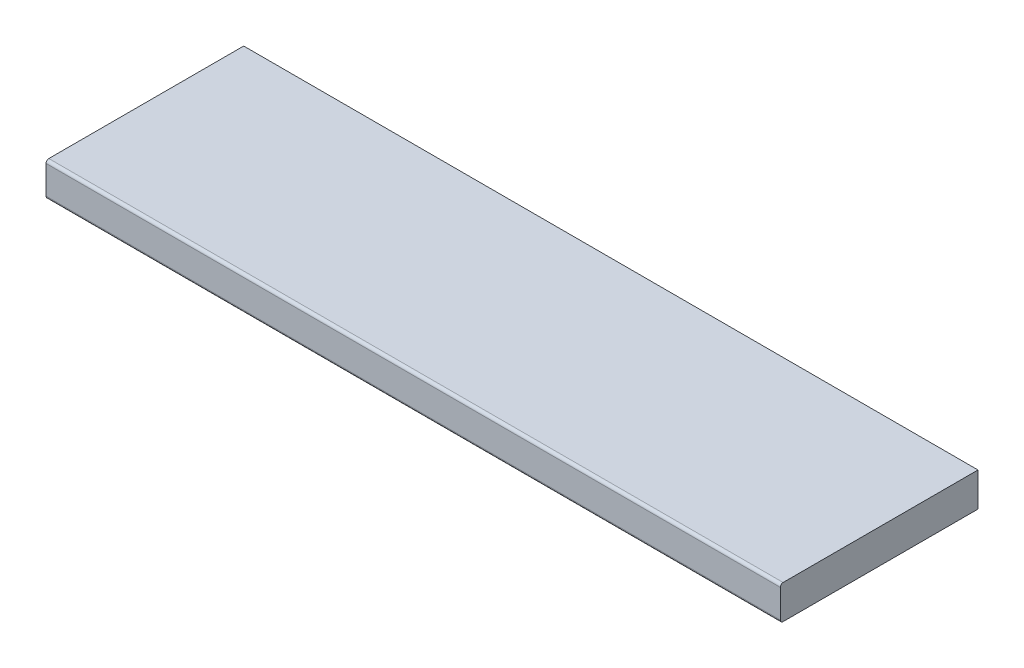
ISO-10303-21;
HEADER;
FILE_DESCRIPTION(('STEP AP214'),'2;1');
FILE_NAME('part.step','',(''),(''),'','','');
FILE_SCHEMA(('AUTOMOTIVE_DESIGN { 1 0 10303 214 1 1 1 1 }'));
ENDSEC;
DATA;
#1=APPLICATION_CONTEXT('core data for automotive mechanical design processes');
#2=APPLICATION_PROTOCOL_DEFINITION('international standard','automotive_design',2000,#1);
#3=PRODUCT_CONTEXT('',#1,'mechanical');
#4=PRODUCT('Part','Part','',(#3));
#5=PRODUCT_RELATED_PRODUCT_CATEGORY('part','',(#4));
#6=PRODUCT_DEFINITION_FORMATION('','',#4);
#7=PRODUCT_DEFINITION_CONTEXT('part definition',#1,'design');
#8=PRODUCT_DEFINITION('design','',#6,#7);
#9=PRODUCT_DEFINITION_SHAPE('','',#8);
#10=(LENGTH_UNIT() NAMED_UNIT(*) SI_UNIT(.MILLI.,.METRE.));
#11=(NAMED_UNIT(*) PLANE_ANGLE_UNIT() SI_UNIT($,.RADIAN.));
#12=(NAMED_UNIT(*) SI_UNIT($,.STERADIAN.) SOLID_ANGLE_UNIT());
#13=UNCERTAINTY_MEASURE_WITH_UNIT(LENGTH_MEASURE(1.E-05),#10,'distance_accuracy_value','');
#14=(GEOMETRIC_REPRESENTATION_CONTEXT(3) GLOBAL_UNCERTAINTY_ASSIGNED_CONTEXT((#13)) GLOBAL_UNIT_ASSIGNED_CONTEXT((#10,
#11,#12)) REPRESENTATION_CONTEXT('',''));
#15=CARTESIAN_POINT('',(0.,0.,0.));
#16=DIRECTION('',(0.,0.,1.));
#17=DIRECTION('',(1.,0.,0.));
#18=AXIS2_PLACEMENT_3D('',#15,#16,#17);
#19=CARTESIAN_POINT('',(-198.947368421053,28.7368421052632,350.));
#20=DIRECTION('',(1.,0.,0.));
#21=DIRECTION('',(0.,0.,-1.));
#22=AXIS2_PLACEMENT_3D('',#19,#20,#21);
#23=PLANE('',#22);
#24=DIRECTION('',(0.,0.,-1.));
#25=VECTOR('',#24,1.);
#26=CARTESIAN_POINT('',(-198.947368421053,-31.2631578947368,350.));
#27=LINE('',#26,#25);
#28=CARTESIAN_POINT('',(-198.947368421053,-31.2631578947368,345.));
#29=VERTEX_POINT('',#28);
#30=CARTESIAN_POINT('',(-198.947368421053,-31.2631578947368,0.));
#31=VERTEX_POINT('',#30);
#32=EDGE_CURVE('E83',#29,#31,#27,.T.);
#33=ORIENTED_EDGE('',*,*,#32,.F.);
#34=CARTESIAN_POINT('',(-198.947368421053,-26.2631578947368,345.));
#35=DIRECTION('',(1.,0.,0.));
#36=DIRECTION('',(0.,0.,-1.));
#37=AXIS2_PLACEMENT_3D('',#34,#35,#36);
#38=CIRCLE('',#37,5.);
#39=CARTESIAN_POINT('',(-198.947368421053,-26.2631578947368,350.));
#40=VERTEX_POINT('',#39);
#41=EDGE_CURVE('E40',#29,#40,#38,.F.);
#42=ORIENTED_EDGE('',*,*,#41,.T.);
#43=DIRECTION('',(0.,-1.,0.));
#44=VECTOR('',#43,1.);
#45=CARTESIAN_POINT('',(-198.947368421053,28.7368421052632,350.));
#46=LINE('',#45,#44);
#47=CARTESIAN_POINT('',(-198.947368421053,23.7368421052632,350.));
#48=VERTEX_POINT('',#47);
#49=EDGE_CURVE('E111',#48,#40,#46,.T.);
#50=ORIENTED_EDGE('',*,*,#49,.F.);
#51=CARTESIAN_POINT('',(-198.947368421053,23.7368421052632,345.));
#52=DIRECTION('',(1.,0.,0.));
#53=DIRECTION('',(0.,0.,-1.));
#54=AXIS2_PLACEMENT_3D('',#51,#52,#53);
#55=CIRCLE('',#54,5.);
#56=CARTESIAN_POINT('',(-198.947368421053,28.7368421052632,345.));
#57=VERTEX_POINT('',#56);
#58=EDGE_CURVE('E47',#48,#57,#55,.F.);
#59=ORIENTED_EDGE('',*,*,#58,.T.);
#60=DIRECTION('',(0.,0.,-1.));
#61=VECTOR('',#60,1.);
#62=CARTESIAN_POINT('',(-198.947368421053,28.7368421052632,350.));
#63=LINE('',#62,#61);
#64=CARTESIAN_POINT('',(-198.947368421053,28.7368421052632,0.));
#65=VERTEX_POINT('',#64);
#66=EDGE_CURVE('E101',#57,#65,#63,.T.);
#67=ORIENTED_EDGE('',*,*,#66,.T.);
#68=DIRECTION('',(0.,-1.,0.));
#69=VECTOR('',#68,1.);
#70=CARTESIAN_POINT('',(-198.947368421053,28.7368421052632,0.));
#71=LINE('',#70,#69);
#72=EDGE_CURVE('E97',#65,#31,#71,.T.);
#73=ORIENTED_EDGE('',*,*,#72,.T.);
#74=EDGE_LOOP('',(#33,#42,#50,#59,#67,#73));
#75=FACE_BOUND('',#74,.T.);
#76=ADVANCED_FACE('F32',(#75),#23,.F.);
#77=CARTESIAN_POINT('',(-198.947368421053,-31.2631578947368,350.));
#78=DIRECTION('',(0.,1.,0.));
#79=DIRECTION('',(0.,0.,1.));
#80=AXIS2_PLACEMENT_3D('',#77,#78,#79);
#81=PLANE('',#80);
#82=DIRECTION('',(0.,0.,-1.));
#83=VECTOR('',#82,1.);
#84=CARTESIAN_POINT('',(1101.05263157895,-31.2631578947368,350.));
#85=LINE('',#84,#83);
#86=CARTESIAN_POINT('',(1101.05263157895,-31.2631578947368,345.));
#87=VERTEX_POINT('',#86);
#88=CARTESIAN_POINT('',(1101.05263157895,-31.2631578947368,0.));
#89=VERTEX_POINT('',#88);
#90=EDGE_CURVE('E91',#87,#89,#85,.T.);
#91=ORIENTED_EDGE('',*,*,#90,.F.);
#92=DIRECTION('',(1.,0.,0.));
#93=VECTOR('',#92,1.);
#94=CARTESIAN_POINT('',(-198.947368421053,-31.2631578947368,345.));
#95=LINE('',#94,#93);
#96=EDGE_CURVE('E55',#87,#29,#95,.F.);
#97=ORIENTED_EDGE('',*,*,#96,.T.);
#98=ORIENTED_EDGE('',*,*,#32,.T.);
#99=DIRECTION('',(1.,0.,0.));
#100=VECTOR('',#99,1.);
#101=CARTESIAN_POINT('',(-198.947368421053,-31.2631578947368,0.));
#102=LINE('',#101,#100);
#103=EDGE_CURVE('E86',#31,#89,#102,.T.);
#104=ORIENTED_EDGE('',*,*,#103,.T.);
#105=EDGE_LOOP('',(#91,#97,#98,#104));
#106=FACE_BOUND('',#105,.T.);
#107=ADVANCED_FACE('F85',(#106),#81,.F.);
#108=CARTESIAN_POINT('',(1101.05263157895,28.7368421052632,350.));
#109=DIRECTION('',(-1.,0.,0.));
#110=DIRECTION('',(0.,0.,1.));
#111=AXIS2_PLACEMENT_3D('',#108,#109,#110);
#112=PLANE('',#111);
#113=DIRECTION('',(0.,1.,0.));
#114=VECTOR('',#113,1.);
#115=CARTESIAN_POINT('',(1101.05263157895,28.7368421052632,350.));
#116=LINE('',#115,#114);
#117=CARTESIAN_POINT('',(1101.05263157895,-26.2631578947368,350.));
#118=VERTEX_POINT('',#117);
#119=CARTESIAN_POINT('',(1101.05263157895,23.7368421052632,350.));
#120=VERTEX_POINT('',#119);
#121=EDGE_CURVE('E105',#118,#120,#116,.T.);
#122=ORIENTED_EDGE('',*,*,#121,.F.);
#123=CARTESIAN_POINT('',(1101.05263157895,-26.2631578947368,345.));
#124=DIRECTION('',(-1.,0.,0.));
#125=DIRECTION('',(0.,0.,1.));
#126=AXIS2_PLACEMENT_3D('',#123,#124,#125);
#127=CIRCLE('',#126,5.);
#128=EDGE_CURVE('E123',#118,#87,#127,.F.);
#129=ORIENTED_EDGE('',*,*,#128,.T.);
#130=ORIENTED_EDGE('',*,*,#90,.T.);
#131=DIRECTION('',(0.,1.,0.));
#132=VECTOR('',#131,1.);
#133=CARTESIAN_POINT('',(1101.05263157895,28.7368421052632,0.));
#134=LINE('',#133,#132);
#135=CARTESIAN_POINT('',(1101.05263157895,28.7368421052632,0.));
#136=VERTEX_POINT('',#135);
#137=EDGE_CURVE('E99',#89,#136,#134,.T.);
#138=ORIENTED_EDGE('',*,*,#137,.T.);
#139=DIRECTION('',(0.,0.,-1.));
#140=VECTOR('',#139,1.);
#141=CARTESIAN_POINT('',(1101.05263157895,28.7368421052632,350.));
#142=LINE('',#141,#140);
#143=CARTESIAN_POINT('',(1101.05263157895,28.7368421052632,345.));
#144=VERTEX_POINT('',#143);
#145=EDGE_CURVE('E113',#144,#136,#142,.T.);
#146=ORIENTED_EDGE('',*,*,#145,.F.);
#147=CARTESIAN_POINT('',(1101.05263157895,23.7368421052632,345.));
#148=DIRECTION('',(-1.,0.,0.));
#149=DIRECTION('',(0.,0.,1.));
#150=AXIS2_PLACEMENT_3D('',#147,#148,#149);
#151=CIRCLE('',#150,5.);
#152=EDGE_CURVE('E121',#144,#120,#151,.F.);
#153=ORIENTED_EDGE('',*,*,#152,.T.);
#154=EDGE_LOOP('',(#122,#129,#130,#138,#146,#153));
#155=FACE_BOUND('',#154,.T.);
#156=ADVANCED_FACE('F136',(#155),#112,.F.);
#157=CARTESIAN_POINT('',(-198.947368421053,28.7368421052632,350.));
#158=DIRECTION('',(0.,-1.,0.));
#159=DIRECTION('',(1.,0.,0.));
#160=AXIS2_PLACEMENT_3D('',#157,#158,#159);
#161=PLANE('',#160);
#162=ORIENTED_EDGE('',*,*,#66,.F.);
#163=DIRECTION('',(-1.,0.,0.));
#164=VECTOR('',#163,1.);
#165=CARTESIAN_POINT('',(1101.05263157895,28.7368421052632,345.));
#166=LINE('',#165,#164);
#167=EDGE_CURVE('E11',#57,#144,#166,.F.);
#168=ORIENTED_EDGE('',*,*,#167,.T.);
#169=ORIENTED_EDGE('',*,*,#145,.T.);
#170=DIRECTION('',(-1.,0.,0.));
#171=VECTOR('',#170,1.);
#172=CARTESIAN_POINT('',(-198.947368421053,28.7368421052632,0.));
#173=LINE('',#172,#171);
#174=EDGE_CURVE('E109',#136,#65,#173,.T.);
#175=ORIENTED_EDGE('',*,*,#174,.T.);
#176=EDGE_LOOP('',(#162,#168,#169,#175));
#177=FACE_BOUND('',#176,.T.);
#178=ADVANCED_FACE('F142',(#177),#161,.F.);
#179=CARTESIAN_POINT('',(0.,0.,350.));
#180=DIRECTION('',(0.,0.,1.));
#181=DIRECTION('',(1.,0.,0.));
#182=AXIS2_PLACEMENT_3D('',#179,#180,#181);
#183=PLANE('',#182);
#184=ORIENTED_EDGE('',*,*,#49,.T.);
#185=DIRECTION('',(1.,0.,0.));
#186=VECTOR('',#185,1.);
#187=CARTESIAN_POINT('',(1101.05263157895,-26.2631578947368,350.));
#188=LINE('',#187,#186);
#189=EDGE_CURVE('E118',#40,#118,#188,.T.);
#190=ORIENTED_EDGE('',*,*,#189,.T.);
#191=ORIENTED_EDGE('',*,*,#121,.T.);
#192=DIRECTION('',(-1.,0.,0.));
#193=VECTOR('',#192,1.);
#194=CARTESIAN_POINT('',(-198.947368421053,23.7368421052632,350.));
#195=LINE('',#194,#193);
#196=EDGE_CURVE('E90',#120,#48,#195,.T.);
#197=ORIENTED_EDGE('',*,*,#196,.T.);
#198=EDGE_LOOP('',(#184,#190,#191,#197));
#199=FACE_BOUND('',#198,.T.);
#200=ADVANCED_FACE('F130',(#199),#183,.T.);
#201=CARTESIAN_POINT('',(0.,0.,0.));
#202=DIRECTION('',(0.,0.,1.));
#203=DIRECTION('',(1.,0.,0.));
#204=AXIS2_PLACEMENT_3D('',#201,#202,#203);
#205=PLANE('',#204);
#206=ORIENTED_EDGE('',*,*,#72,.F.);
#207=ORIENTED_EDGE('',*,*,#174,.F.);
#208=ORIENTED_EDGE('',*,*,#137,.F.);
#209=ORIENTED_EDGE('',*,*,#103,.F.);
#210=EDGE_LOOP('',(#206,#207,#208,#209));
#211=FACE_BOUND('',#210,.T.);
#212=ADVANCED_FACE('F95',(#211),#205,.F.);
#213=CARTESIAN_POINT('',(0.,-26.2631578947368,345.));
#214=DIRECTION('',(-1.,0.,0.));
#215=DIRECTION('',(0.,0.,1.));
#216=AXIS2_PLACEMENT_3D('',#213,#214,#215);
#217=CYLINDRICAL_SURFACE('',#216,5.);
#218=ORIENTED_EDGE('',*,*,#41,.F.);
#219=ORIENTED_EDGE('',*,*,#96,.F.);
#220=ORIENTED_EDGE('',*,*,#128,.F.);
#221=ORIENTED_EDGE('',*,*,#189,.F.);
#222=EDGE_LOOP('',(#218,#219,#220,#221));
#223=FACE_BOUND('',#222,.T.);
#224=ADVANCED_FACE('F134',(#223),#217,.T.);
#225=CARTESIAN_POINT('',(0.,23.7368421052632,345.));
#226=DIRECTION('',(1.,0.,0.));
#227=DIRECTION('',(0.,1.,0.));
#228=AXIS2_PLACEMENT_3D('',#225,#226,#227);
#229=CYLINDRICAL_SURFACE('',#228,5.);
#230=ORIENTED_EDGE('',*,*,#152,.F.);
#231=ORIENTED_EDGE('',*,*,#167,.F.);
#232=ORIENTED_EDGE('',*,*,#58,.F.);
#233=ORIENTED_EDGE('',*,*,#196,.F.);
#234=EDGE_LOOP('',(#230,#231,#232,#233));
#235=FACE_BOUND('',#234,.T.);
#236=ADVANCED_FACE('F34',(#235),#229,.T.);
#237=CLOSED_SHELL('',(#76,#107,#156,#178,#200,#212,#224,#236));
#238=MANIFOLD_SOLID_BREP('B2',#237);
#239=ADVANCED_BREP_SHAPE_REPRESENTATION('',(#18,#238),#14);
#240=SHAPE_DEFINITION_REPRESENTATION(#9,#239);
ENDSEC;
END-ISO-10303-21;
